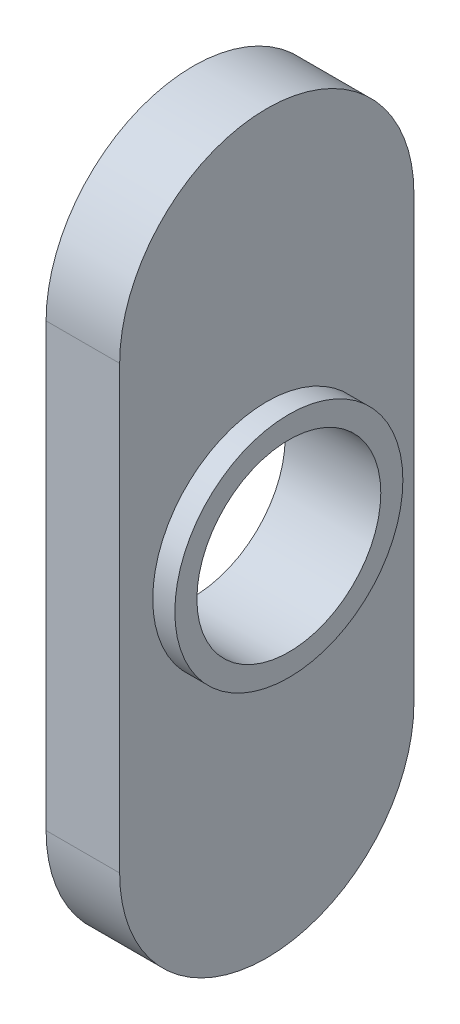
ISO-10303-21;
HEADER;
FILE_DESCRIPTION(('STEP AP214'),'2;1');
FILE_NAME('part.step','',(''),(''),'','','');
FILE_SCHEMA(('AUTOMOTIVE_DESIGN { 1 0 10303 214 1 1 1 1 }'));
ENDSEC;
DATA;
#1=APPLICATION_CONTEXT('core data for automotive mechanical design processes');
#2=APPLICATION_PROTOCOL_DEFINITION('international standard','automotive_design',2000,#1);
#3=PRODUCT_CONTEXT('',#1,'mechanical');
#4=PRODUCT('Part','Part','',(#3));
#5=PRODUCT_RELATED_PRODUCT_CATEGORY('part','',(#4));
#6=PRODUCT_DEFINITION_FORMATION('','',#4);
#7=PRODUCT_DEFINITION_CONTEXT('part definition',#1,'design');
#8=PRODUCT_DEFINITION('design','',#6,#7);
#9=PRODUCT_DEFINITION_SHAPE('','',#8);
#10=(LENGTH_UNIT() NAMED_UNIT(*) SI_UNIT(.MILLI.,.METRE.));
#11=(NAMED_UNIT(*) PLANE_ANGLE_UNIT() SI_UNIT($,.RADIAN.));
#12=(NAMED_UNIT(*) SI_UNIT($,.STERADIAN.) SOLID_ANGLE_UNIT());
#13=UNCERTAINTY_MEASURE_WITH_UNIT(LENGTH_MEASURE(1.E-05),#10,'distance_accuracy_value','');
#14=(GEOMETRIC_REPRESENTATION_CONTEXT(3) GLOBAL_UNCERTAINTY_ASSIGNED_CONTEXT((#13)) GLOBAL_UNIT_ASSIGNED_CONTEXT((#10,
#11,#12)) REPRESENTATION_CONTEXT('',''));
#15=CARTESIAN_POINT('',(0.,0.,0.));
#16=DIRECTION('',(0.,0.,1.));
#17=DIRECTION('',(1.,0.,0.));
#18=AXIS2_PLACEMENT_3D('',#15,#16,#17);
#19=CARTESIAN_POINT('',(2.54,7.62,0.));
#20=DIRECTION('',(1.,0.,0.));
#21=DIRECTION('',(0.,0.,-1.));
#22=AXIS2_PLACEMENT_3D('',#19,#20,#21);
#23=PLANE('',#22);
#24=CARTESIAN_POINT('',(2.54,7.62,0.));
#25=DIRECTION('',(1.,0.,0.));
#26=DIRECTION('',(0.,0.,-1.));
#27=AXIS2_PLACEMENT_3D('',#24,#25,#26);
#28=CIRCLE('',#27,5.08);
#29=CARTESIAN_POINT('',(2.54,7.62,-5.07999999999999));
#30=VERTEX_POINT('',#29);
#31=CARTESIAN_POINT('',(2.54,7.62,5.08));
#32=VERTEX_POINT('',#31);
#33=EDGE_CURVE('E86',#30,#32,#28,.T.);
#34=ORIENTED_EDGE('',*,*,#33,.T.);
#35=DIRECTION('',(0.,-1.,0.));
#36=VECTOR('',#35,1.);
#37=CARTESIAN_POINT('',(2.54,7.62,5.08));
#38=LINE('',#37,#36);
#39=CARTESIAN_POINT('',(2.54,-7.62,5.07999999999999));
#40=VERTEX_POINT('',#39);
#41=EDGE_CURVE('E81',#32,#40,#38,.T.);
#42=ORIENTED_EDGE('',*,*,#41,.T.);
#43=CARTESIAN_POINT('',(2.54,-7.62,0.));
#44=DIRECTION('',(1.,0.,0.));
#45=DIRECTION('',(0.,0.,-1.));
#46=AXIS2_PLACEMENT_3D('',#43,#44,#45);
#47=CIRCLE('',#46,5.08);
#48=CARTESIAN_POINT('',(2.54,-7.62,-5.08));
#49=VERTEX_POINT('',#48);
#50=EDGE_CURVE('E84',#40,#49,#47,.T.);
#51=ORIENTED_EDGE('',*,*,#50,.T.);
#52=DIRECTION('',(0.,1.,0.));
#53=VECTOR('',#52,1.);
#54=CARTESIAN_POINT('',(2.54,7.62,-5.07999999999999));
#55=LINE('',#54,#53);
#56=EDGE_CURVE('E51',#49,#30,#55,.T.);
#57=ORIENTED_EDGE('',*,*,#56,.T.);
#58=EDGE_LOOP('',(#34,#42,#51,#57));
#59=FACE_BOUND('',#58,.T.);
#60=CARTESIAN_POINT('',(2.54,0.,0.));
#61=DIRECTION('',(1.,0.,0.));
#62=DIRECTION('',(0.,0.,-1.));
#63=AXIS2_PLACEMENT_3D('',#60,#61,#62);
#64=CIRCLE('',#63,3.937);
#65=CARTESIAN_POINT('',(2.54,0.,3.937));
#66=VERTEX_POINT('',#65);
#67=EDGE_CURVE('E116',#66,#66,#64,.T.);
#68=ORIENTED_EDGE('',*,*,#67,.F.);
#69=EDGE_LOOP('',(#68));
#70=FACE_BOUND('',#69,.T.);
#71=ADVANCED_FACE('F34',(#59,#70),#23,.T.);
#72=CARTESIAN_POINT('',(0.,7.62,0.));
#73=DIRECTION('',(1.,0.,0.));
#74=DIRECTION('',(0.,0.,-1.));
#75=AXIS2_PLACEMENT_3D('',#72,#73,#74);
#76=PLANE('',#75);
#77=CARTESIAN_POINT('',(0.,7.62,0.));
#78=DIRECTION('',(1.,0.,0.));
#79=DIRECTION('',(0.,0.,-1.));
#80=AXIS2_PLACEMENT_3D('',#77,#78,#79);
#81=CIRCLE('',#80,5.08);
#82=CARTESIAN_POINT('',(0.,7.62,-5.07999999999999));
#83=VERTEX_POINT('',#82);
#84=CARTESIAN_POINT('',(0.,7.62,5.08));
#85=VERTEX_POINT('',#84);
#86=EDGE_CURVE('E98',#83,#85,#81,.T.);
#87=ORIENTED_EDGE('',*,*,#86,.F.);
#88=DIRECTION('',(0.,1.,0.));
#89=VECTOR('',#88,1.);
#90=CARTESIAN_POINT('',(0.,7.62,-5.07999999999999));
#91=LINE('',#90,#89);
#92=CARTESIAN_POINT('',(0.,-7.62,-5.08));
#93=VERTEX_POINT('',#92);
#94=EDGE_CURVE('E74',#93,#83,#91,.T.);
#95=ORIENTED_EDGE('',*,*,#94,.F.);
#96=CARTESIAN_POINT('',(0.,-7.62,0.));
#97=DIRECTION('',(1.,0.,0.));
#98=DIRECTION('',(0.,0.,-1.));
#99=AXIS2_PLACEMENT_3D('',#96,#97,#98);
#100=CIRCLE('',#99,5.08);
#101=CARTESIAN_POINT('',(0.,-7.62,5.07999999999999));
#102=VERTEX_POINT('',#101);
#103=EDGE_CURVE('E68',#102,#93,#100,.T.);
#104=ORIENTED_EDGE('',*,*,#103,.F.);
#105=DIRECTION('',(0.,-1.,0.));
#106=VECTOR('',#105,1.);
#107=CARTESIAN_POINT('',(0.,7.62,5.08));
#108=LINE('',#107,#106);
#109=EDGE_CURVE('E90',#85,#102,#108,.T.);
#110=ORIENTED_EDGE('',*,*,#109,.F.);
#111=EDGE_LOOP('',(#87,#95,#104,#110));
#112=FACE_BOUND('',#111,.T.);
#113=CARTESIAN_POINT('',(0.,0.,0.));
#114=DIRECTION('',(1.,0.,0.));
#115=DIRECTION('',(0.,0.,-1.));
#116=AXIS2_PLACEMENT_3D('',#113,#114,#115);
#117=CIRCLE('',#116,3.175);
#118=CARTESIAN_POINT('',(0.,0.,-3.175));
#119=VERTEX_POINT('',#118);
#120=EDGE_CURVE('E101',#119,#119,#117,.T.);
#121=ORIENTED_EDGE('',*,*,#120,.T.);
#122=EDGE_LOOP('',(#121));
#123=FACE_BOUND('',#122,.T.);
#124=ADVANCED_FACE('F109',(#112,#123),#76,.F.);
#125=CARTESIAN_POINT('',(2.54,7.62,0.));
#126=DIRECTION('',(-1.,0.,0.));
#127=DIRECTION('',(0.,0.,1.));
#128=AXIS2_PLACEMENT_3D('',#125,#126,#127);
#129=CYLINDRICAL_SURFACE('',#128,5.08);
#130=ORIENTED_EDGE('',*,*,#86,.T.);
#131=DIRECTION('',(-1.,0.,0.));
#132=VECTOR('',#131,1.);
#133=CARTESIAN_POINT('',(2.54,7.62,5.08));
#134=LINE('',#133,#132);
#135=EDGE_CURVE('E11',#32,#85,#134,.T.);
#136=ORIENTED_EDGE('',*,*,#135,.F.);
#137=ORIENTED_EDGE('',*,*,#33,.F.);
#138=DIRECTION('',(-1.,0.,0.));
#139=VECTOR('',#138,1.);
#140=CARTESIAN_POINT('',(2.54,7.62,-5.07999999999999));
#141=LINE('',#140,#139);
#142=EDGE_CURVE('E94',#30,#83,#141,.T.);
#143=ORIENTED_EDGE('',*,*,#142,.T.);
#144=EDGE_LOOP('',(#130,#136,#137,#143));
#145=FACE_BOUND('',#144,.T.);
#146=ADVANCED_FACE('F36',(#145),#129,.T.);
#147=CARTESIAN_POINT('',(2.54,7.62,5.08));
#148=DIRECTION('',(0.,0.,-1.));
#149=DIRECTION('',(0.,1.,0.));
#150=AXIS2_PLACEMENT_3D('',#147,#148,#149);
#151=PLANE('',#150);
#152=ORIENTED_EDGE('',*,*,#109,.T.);
#153=DIRECTION('',(-1.,0.,0.));
#154=VECTOR('',#153,1.);
#155=CARTESIAN_POINT('',(2.54,-7.62,5.07999999999999));
#156=LINE('',#155,#154);
#157=EDGE_CURVE('E43',#40,#102,#156,.T.);
#158=ORIENTED_EDGE('',*,*,#157,.F.);
#159=ORIENTED_EDGE('',*,*,#41,.F.);
#160=ORIENTED_EDGE('',*,*,#135,.T.);
#161=EDGE_LOOP('',(#152,#158,#159,#160));
#162=FACE_BOUND('',#161,.T.);
#163=ADVANCED_FACE('F89',(#162),#151,.F.);
#164=CARTESIAN_POINT('',(2.54,-7.62,0.));
#165=DIRECTION('',(-1.,0.,0.));
#166=DIRECTION('',(0.,0.,1.));
#167=AXIS2_PLACEMENT_3D('',#164,#165,#166);
#168=CYLINDRICAL_SURFACE('',#167,5.08);
#169=ORIENTED_EDGE('',*,*,#103,.T.);
#170=DIRECTION('',(-1.,0.,0.));
#171=VECTOR('',#170,1.);
#172=CARTESIAN_POINT('',(2.54,-7.62,-5.08));
#173=LINE('',#172,#171);
#174=EDGE_CURVE('E91',#49,#93,#173,.T.);
#175=ORIENTED_EDGE('',*,*,#174,.F.);
#176=ORIENTED_EDGE('',*,*,#50,.F.);
#177=ORIENTED_EDGE('',*,*,#157,.T.);
#178=EDGE_LOOP('',(#169,#175,#176,#177));
#179=FACE_BOUND('',#178,.T.);
#180=ADVANCED_FACE('F92',(#179),#168,.T.);
#181=CARTESIAN_POINT('',(2.54,7.62,-5.07999999999999));
#182=DIRECTION('',(0.,0.,1.));
#183=DIRECTION('',(0.,-1.,0.));
#184=AXIS2_PLACEMENT_3D('',#181,#182,#183);
#185=PLANE('',#184);
#186=ORIENTED_EDGE('',*,*,#94,.T.);
#187=ORIENTED_EDGE('',*,*,#142,.F.);
#188=ORIENTED_EDGE('',*,*,#56,.F.);
#189=ORIENTED_EDGE('',*,*,#174,.T.);
#190=EDGE_LOOP('',(#186,#187,#188,#189));
#191=FACE_BOUND('',#190,.T.);
#192=ADVANCED_FACE('F106',(#191),#185,.F.);
#193=CARTESIAN_POINT('',(2.54,0.,0.));
#194=DIRECTION('',(-1.,0.,0.));
#195=DIRECTION('',(0.,0.,1.));
#196=AXIS2_PLACEMENT_3D('',#193,#194,#195);
#197=CYLINDRICAL_SURFACE('',#196,3.175);
#198=ORIENTED_EDGE('',*,*,#120,.F.);
#199=EDGE_LOOP('',(#198));
#200=FACE_BOUND('',#199,.T.);
#201=CARTESIAN_POINT('',(3.302,0.,0.));
#202=DIRECTION('',(1.,0.,0.));
#203=DIRECTION('',(0.,0.,-1.));
#204=AXIS2_PLACEMENT_3D('',#201,#202,#203);
#205=CIRCLE('',#204,3.175);
#206=CARTESIAN_POINT('',(3.302,0.,-3.175));
#207=VERTEX_POINT('',#206);
#208=EDGE_CURVE('E119',#207,#207,#205,.T.);
#209=ORIENTED_EDGE('',*,*,#208,.T.);
#210=EDGE_LOOP('',(#209));
#211=FACE_BOUND('',#210,.T.);
#212=ADVANCED_FACE('F125',(#200,#211),#197,.F.);
#213=CARTESIAN_POINT('',(3.302,0.,0.));
#214=DIRECTION('',(1.,0.,0.));
#215=DIRECTION('',(0.,0.,-1.));
#216=AXIS2_PLACEMENT_3D('',#213,#214,#215);
#217=PLANE('',#216);
#218=CARTESIAN_POINT('',(3.302,0.,0.));
#219=DIRECTION('',(1.,0.,0.));
#220=DIRECTION('',(0.,0.,-1.));
#221=AXIS2_PLACEMENT_3D('',#218,#219,#220);
#222=CIRCLE('',#221,3.937);
#223=CARTESIAN_POINT('',(3.302,0.,3.937));
#224=VERTEX_POINT('',#223);
#225=EDGE_CURVE('E115',#224,#224,#222,.T.);
#226=ORIENTED_EDGE('',*,*,#225,.T.);
#227=EDGE_LOOP('',(#226));
#228=FACE_BOUND('',#227,.T.);
#229=ORIENTED_EDGE('',*,*,#208,.F.);
#230=EDGE_LOOP('',(#229));
#231=FACE_BOUND('',#230,.T.);
#232=ADVANCED_FACE('F127',(#228,#231),#217,.T.);
#233=CARTESIAN_POINT('',(3.302,0.,0.));
#234=DIRECTION('',(-1.,0.,0.));
#235=DIRECTION('',(0.,0.,1.));
#236=AXIS2_PLACEMENT_3D('',#233,#234,#235);
#237=CYLINDRICAL_SURFACE('',#236,3.937);
#238=CARTESIAN_POINT('',(3.302,0.,3.937));
#239=CARTESIAN_POINT('',(3.2940625,0.,3.937));
#240=CARTESIAN_POINT('',(3.286125,0.,3.937));
#241=CARTESIAN_POINT('',(3.27025,0.,3.937));
#242=CARTESIAN_POINT('',(3.2623125,0.,3.937));
#243=CARTESIAN_POINT('',(3.2464375,0.,3.937));
#244=CARTESIAN_POINT('',(3.2385,0.,3.937));
#245=CARTESIAN_POINT('',(3.222625,0.,3.937));
#246=CARTESIAN_POINT('',(3.2146875,0.,3.937));
#247=CARTESIAN_POINT('',(3.1988125,0.,3.937));
#248=CARTESIAN_POINT('',(3.190875,0.,3.937));
#249=CARTESIAN_POINT('',(3.175,0.,3.937));
#250=CARTESIAN_POINT('',(3.1670625,0.,3.937));
#251=CARTESIAN_POINT('',(3.1511875,0.,3.937));
#252=CARTESIAN_POINT('',(3.14325,0.,3.937));
#253=CARTESIAN_POINT('',(3.127375,0.,3.937));
#254=CARTESIAN_POINT('',(3.1194375,0.,3.937));
#255=CARTESIAN_POINT('',(3.1035625,0.,3.937));
#256=CARTESIAN_POINT('',(3.095625,0.,3.937));
#257=CARTESIAN_POINT('',(3.07975,0.,3.937));
#258=CARTESIAN_POINT('',(3.0718125,0.,3.937));
#259=CARTESIAN_POINT('',(3.0559375,0.,3.937));
#260=CARTESIAN_POINT('',(3.048,0.,3.937));
#261=CARTESIAN_POINT('',(3.032125,0.,3.937));
#262=CARTESIAN_POINT('',(3.0241875,0.,3.937));
#263=CARTESIAN_POINT('',(3.0083125,0.,3.937));
#264=CARTESIAN_POINT('',(3.000375,0.,3.937));
#265=CARTESIAN_POINT('',(2.9845,0.,3.937));
#266=CARTESIAN_POINT('',(2.9765625,0.,3.937));
#267=CARTESIAN_POINT('',(2.9606875,0.,3.937));
#268=CARTESIAN_POINT('',(2.95275,0.,3.937));
#269=CARTESIAN_POINT('',(2.936875,0.,3.937));
#270=CARTESIAN_POINT('',(2.9289375,0.,3.937));
#271=CARTESIAN_POINT('',(2.9130625,0.,3.937));
#272=CARTESIAN_POINT('',(2.905125,0.,3.937));
#273=CARTESIAN_POINT('',(2.88925,0.,3.937));
#274=CARTESIAN_POINT('',(2.8813125,0.,3.937));
#275=CARTESIAN_POINT('',(2.8654375,0.,3.937));
#276=CARTESIAN_POINT('',(2.8575,0.,3.937));
#277=CARTESIAN_POINT('',(2.841625,0.,3.937));
#278=CARTESIAN_POINT('',(2.8336875,0.,3.937));
#279=CARTESIAN_POINT('',(2.8178125,0.,3.937));
#280=CARTESIAN_POINT('',(2.809875,0.,3.937));
#281=CARTESIAN_POINT('',(2.794,0.,3.937));
#282=CARTESIAN_POINT('',(2.7860625,0.,3.937));
#283=CARTESIAN_POINT('',(2.7701875,0.,3.937));
#284=CARTESIAN_POINT('',(2.76225,0.,3.937));
#285=CARTESIAN_POINT('',(2.746375,0.,3.937));
#286=CARTESIAN_POINT('',(2.7384375,0.,3.937));
#287=CARTESIAN_POINT('',(2.7225625,0.,3.937));
#288=CARTESIAN_POINT('',(2.714625,0.,3.937));
#289=CARTESIAN_POINT('',(2.69875,0.,3.937));
#290=CARTESIAN_POINT('',(2.6908125,0.,3.937));
#291=CARTESIAN_POINT('',(2.6749375,0.,3.937));
#292=CARTESIAN_POINT('',(2.667,0.,3.937));
#293=CARTESIAN_POINT('',(2.651125,0.,3.937));
#294=CARTESIAN_POINT('',(2.6431875,0.,3.937));
#295=CARTESIAN_POINT('',(2.6273125,0.,3.937));
#296=CARTESIAN_POINT('',(2.619375,0.,3.937));
#297=CARTESIAN_POINT('',(2.6035,0.,3.937));
#298=CARTESIAN_POINT('',(2.5955625,0.,3.937));
#299=CARTESIAN_POINT('',(2.5796875,0.,3.937));
#300=CARTESIAN_POINT('',(2.57175,0.,3.937));
#301=CARTESIAN_POINT('',(2.555875,0.,3.937));
#302=CARTESIAN_POINT('',(2.5479375,0.,3.937));
#303=CARTESIAN_POINT('',(2.54,0.,3.937));
#304=B_SPLINE_CURVE_WITH_KNOTS('',3,(#238,#239,#240,#241,#242,#243,#244,#245,#246,#247,#248,
#249,#250,#251,#252,#253,#254,#255,#256,#257,#258,#259,#260,#261,#262,#263,#264,#265,#266,#267,
#268,#269,#270,#271,#272,#273,#274,#275,#276,#277,#278,#279,#280,#281,#282,#283,#284,#285,#286,
#287,#288,#289,#290,#291,#292,#293,#294,#295,#296,#297,#298,#299,#300,#301,#302,#303),
.UNSPECIFIED.,.F.,.F.,(4,2,2,2,2,2,2,2,2,2,2,2,2,2,2,2,2,2,2,2,2,2,2,2,2,2,2,2,2,2,2,2,4),(0.,
0.0238125,0.0476249999999999,0.0714374999999999,0.0952499999999998,0.1190625,0.142875,0.1666875,
0.1905,0.2143125,0.238125,0.2619375,0.28575,0.3095625,0.333375,0.3571875,0.381,0.4048125,
0.428625,0.4524375,0.47625,0.5000625,0.523875,0.5476875,0.5715,0.5953125,0.619125,0.6429375,
0.66675,0.6905625,0.714375,0.7381875,0.762),.UNSPECIFIED.);
#305=EDGE_CURVE('BSEAM129',#224,#66,#304,.T.);
#306=ORIENTED_EDGE('',*,*,#225,.F.);
#307=ORIENTED_EDGE('',*,*,#67,.T.);
#308=ORIENTED_EDGE('',*,*,#305,.T.);
#309=ORIENTED_EDGE('',*,*,#305,.F.);
#310=EDGE_LOOP('',(#306,#308,#307,#309));
#311=FACE_BOUND('',#310,.T.);
#312=ADVANCED_FACE('F129',(#311),#237,.T.);
#313=CLOSED_SHELL('',(#71,#124,#146,#163,#180,#192,#212,#232,#312));
#314=MANIFOLD_SOLID_BREP('B2',#313);
#315=ADVANCED_BREP_SHAPE_REPRESENTATION('',(#18,#314),#14);
#316=SHAPE_DEFINITION_REPRESENTATION(#9,#315);
ENDSEC;
END-ISO-10303-21;
